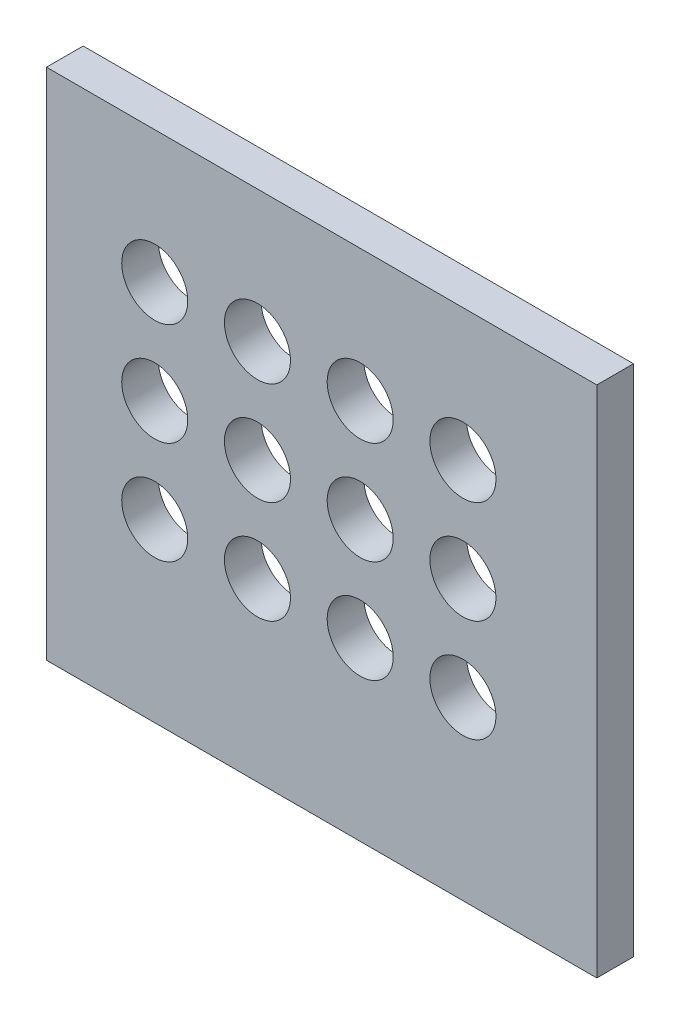
ISO-10303-21;
HEADER;
FILE_DESCRIPTION(('STEP AP214'),'2;1');
FILE_NAME('part.step','',(''),(''),'','','');
FILE_SCHEMA(('AUTOMOTIVE_DESIGN { 1 0 10303 214 1 1 1 1 }'));
ENDSEC;
DATA;
#1=APPLICATION_CONTEXT('core data for automotive mechanical design processes');
#2=APPLICATION_PROTOCOL_DEFINITION('international standard','automotive_design',2000,#1);
#3=PRODUCT_CONTEXT('',#1,'mechanical');
#4=PRODUCT('Part','Part','',(#3));
#5=PRODUCT_RELATED_PRODUCT_CATEGORY('part','',(#4));
#6=PRODUCT_DEFINITION_FORMATION('','',#4);
#7=PRODUCT_DEFINITION_CONTEXT('part definition',#1,'design');
#8=PRODUCT_DEFINITION('design','',#6,#7);
#9=PRODUCT_DEFINITION_SHAPE('','',#8);
#10=(LENGTH_UNIT() NAMED_UNIT(*) SI_UNIT(.MILLI.,.METRE.));
#11=(NAMED_UNIT(*) PLANE_ANGLE_UNIT() SI_UNIT($,.RADIAN.));
#12=(NAMED_UNIT(*) SI_UNIT($,.STERADIAN.) SOLID_ANGLE_UNIT());
#13=UNCERTAINTY_MEASURE_WITH_UNIT(LENGTH_MEASURE(1.E-05),#10,'distance_accuracy_value','');
#14=(GEOMETRIC_REPRESENTATION_CONTEXT(3) GLOBAL_UNCERTAINTY_ASSIGNED_CONTEXT((#13)) GLOBAL_UNIT_ASSIGNED_CONTEXT((#10,
#11,#12)) REPRESENTATION_CONTEXT('',''));
#15=CARTESIAN_POINT('',(0.,0.,0.));
#16=DIRECTION('',(0.,0.,1.));
#17=DIRECTION('',(1.,0.,0.));
#18=AXIS2_PLACEMENT_3D('',#15,#16,#17);
#19=CARTESIAN_POINT('',(75.,70.,0.));
#20=DIRECTION('',(0.,1.,0.));
#21=DIRECTION('',(0.,0.,1.));
#22=AXIS2_PLACEMENT_3D('',#19,#20,#21);
#23=PLANE('',#22);
#24=DIRECTION('',(-1.,0.,0.));
#25=VECTOR('',#24,1.);
#26=CARTESIAN_POINT('',(75.,70.,10.));
#27=LINE('',#26,#25);
#28=CARTESIAN_POINT('',(75.,70.,10.));
#29=VERTEX_POINT('',#28);
#30=CARTESIAN_POINT('',(-75.,70.,10.));
#31=VERTEX_POINT('',#30);
#32=EDGE_CURVE('E104',#29,#31,#27,.T.);
#33=ORIENTED_EDGE('',*,*,#32,.F.);
#34=DIRECTION('',(0.,0.,1.));
#35=VECTOR('',#34,1.);
#36=CARTESIAN_POINT('',(75.,70.,0.));
#37=LINE('',#36,#35);
#38=CARTESIAN_POINT('',(75.,70.,0.));
#39=VERTEX_POINT('',#38);
#40=EDGE_CURVE('E11',#39,#29,#37,.T.);
#41=ORIENTED_EDGE('',*,*,#40,.F.);
#42=DIRECTION('',(-1.,0.,0.));
#43=VECTOR('',#42,1.);
#44=CARTESIAN_POINT('',(75.,70.,0.));
#45=LINE('',#44,#43);
#46=CARTESIAN_POINT('',(-75.,70.,0.));
#47=VERTEX_POINT('',#46);
#48=EDGE_CURVE('E97',#39,#47,#45,.T.);
#49=ORIENTED_EDGE('',*,*,#48,.T.);
#50=DIRECTION('',(0.,0.,1.));
#51=VECTOR('',#50,1.);
#52=CARTESIAN_POINT('',(-75.,70.,0.));
#53=LINE('',#52,#51);
#54=EDGE_CURVE('E42',#47,#31,#53,.T.);
#55=ORIENTED_EDGE('',*,*,#54,.T.);
#56=EDGE_LOOP('',(#33,#41,#49,#55));
#57=FACE_BOUND('',#56,.T.);
#58=ADVANCED_FACE('F39',(#57),#23,.T.);
#59=CARTESIAN_POINT('',(75.,-70.,0.));
#60=DIRECTION('',(1.,0.,0.));
#61=DIRECTION('',(0.,0.,-1.));
#62=AXIS2_PLACEMENT_3D('',#59,#60,#61);
#63=PLANE('',#62);
#64=DIRECTION('',(0.,1.,0.));
#65=VECTOR('',#64,1.);
#66=CARTESIAN_POINT('',(75.,-70.,10.));
#67=LINE('',#66,#65);
#68=CARTESIAN_POINT('',(75.,-70.,10.));
#69=VERTEX_POINT('',#68);
#70=EDGE_CURVE('E99',#69,#29,#67,.T.);
#71=ORIENTED_EDGE('',*,*,#70,.F.);
#72=DIRECTION('',(0.,0.,1.));
#73=VECTOR('',#72,1.);
#74=CARTESIAN_POINT('',(75.,-70.,0.));
#75=LINE('',#74,#73);
#76=CARTESIAN_POINT('',(75.,-70.,0.));
#77=VERTEX_POINT('',#76);
#78=EDGE_CURVE('E48',#77,#69,#75,.T.);
#79=ORIENTED_EDGE('',*,*,#78,.F.);
#80=DIRECTION('',(0.,1.,0.));
#81=VECTOR('',#80,1.);
#82=CARTESIAN_POINT('',(75.,-70.,0.));
#83=LINE('',#82,#81);
#84=EDGE_CURVE('E94',#77,#39,#83,.T.);
#85=ORIENTED_EDGE('',*,*,#84,.T.);
#86=ORIENTED_EDGE('',*,*,#40,.T.);
#87=EDGE_LOOP('',(#71,#79,#85,#86));
#88=FACE_BOUND('',#87,.T.);
#89=ADVANCED_FACE('F115',(#88),#63,.T.);
#90=CARTESIAN_POINT('',(-75.,-70.,0.));
#91=DIRECTION('',(0.,-1.,0.));
#92=DIRECTION('',(0.,0.,-1.));
#93=AXIS2_PLACEMENT_3D('',#90,#91,#92);
#94=PLANE('',#93);
#95=DIRECTION('',(1.,0.,0.));
#96=VECTOR('',#95,1.);
#97=CARTESIAN_POINT('',(-75.,-70.,10.));
#98=LINE('',#97,#96);
#99=CARTESIAN_POINT('',(-75.,-70.,10.));
#100=VERTEX_POINT('',#99);
#101=EDGE_CURVE('E89',#100,#69,#98,.T.);
#102=ORIENTED_EDGE('',*,*,#101,.F.);
#103=DIRECTION('',(0.,0.,1.));
#104=VECTOR('',#103,1.);
#105=CARTESIAN_POINT('',(-75.,-70.,0.));
#106=LINE('',#105,#104);
#107=CARTESIAN_POINT('',(-75.,-70.,0.));
#108=VERTEX_POINT('',#107);
#109=EDGE_CURVE('E84',#108,#100,#106,.T.);
#110=ORIENTED_EDGE('',*,*,#109,.F.);
#111=DIRECTION('',(1.,0.,0.));
#112=VECTOR('',#111,1.);
#113=CARTESIAN_POINT('',(-75.,-70.,0.));
#114=LINE('',#113,#112);
#115=EDGE_CURVE('E87',#108,#77,#114,.T.);
#116=ORIENTED_EDGE('',*,*,#115,.T.);
#117=ORIENTED_EDGE('',*,*,#78,.T.);
#118=EDGE_LOOP('',(#102,#110,#116,#117));
#119=FACE_BOUND('',#118,.T.);
#120=ADVANCED_FACE('F86',(#119),#94,.T.);
#121=CARTESIAN_POINT('',(-75.,70.,0.));
#122=DIRECTION('',(-1.,0.,0.));
#123=DIRECTION('',(0.,0.,1.));
#124=AXIS2_PLACEMENT_3D('',#121,#122,#123);
#125=PLANE('',#124);
#126=DIRECTION('',(0.,-1.,0.));
#127=VECTOR('',#126,1.);
#128=CARTESIAN_POINT('',(-75.,70.,10.));
#129=LINE('',#128,#127);
#130=EDGE_CURVE('E107',#31,#100,#129,.T.);
#131=ORIENTED_EDGE('',*,*,#130,.F.);
#132=ORIENTED_EDGE('',*,*,#54,.F.);
#133=DIRECTION('',(0.,-1.,0.));
#134=VECTOR('',#133,1.);
#135=CARTESIAN_POINT('',(-75.,70.,0.));
#136=LINE('',#135,#134);
#137=EDGE_CURVE('E93',#47,#108,#136,.T.);
#138=ORIENTED_EDGE('',*,*,#137,.T.);
#139=ORIENTED_EDGE('',*,*,#109,.T.);
#140=EDGE_LOOP('',(#131,#132,#138,#139));
#141=FACE_BOUND('',#140,.T.);
#142=ADVANCED_FACE('F96',(#141),#125,.T.);
#143=CARTESIAN_POINT('',(0.,0.,0.));
#144=DIRECTION('',(0.,0.,1.));
#145=DIRECTION('',(1.,0.,0.));
#146=AXIS2_PLACEMENT_3D('',#143,#144,#145);
#147=PLANE('',#146);
#148=CARTESIAN_POINT('',(38.5,34.,0.));
#149=DIRECTION('',(0.,0.,1.));
#150=DIRECTION('',(-1.,0.,0.));
#151=AXIS2_PLACEMENT_3D('',#148,#149,#150);
#152=CIRCLE('',#151,9.);
#153=CARTESIAN_POINT('',(29.5,34.,0.));
#154=VERTEX_POINT('',#153);
#155=EDGE_CURVE('E188',#154,#154,#152,.T.);
#156=ORIENTED_EDGE('',*,*,#155,.T.);
#157=EDGE_LOOP('',(#156));
#158=FACE_BOUND('',#157,.T.);
#159=CARTESIAN_POINT('',(10.5,34.,0.));
#160=DIRECTION('',(0.,0.,1.));
#161=DIRECTION('',(-1.,0.,0.));
#162=AXIS2_PLACEMENT_3D('',#159,#160,#161);
#163=CIRCLE('',#162,9.);
#164=CARTESIAN_POINT('',(1.5,34.,0.));
#165=VERTEX_POINT('',#164);
#166=EDGE_CURVE('E196',#165,#165,#163,.T.);
#167=ORIENTED_EDGE('',*,*,#166,.T.);
#168=EDGE_LOOP('',(#167));
#169=FACE_BOUND('',#168,.T.);
#170=CARTESIAN_POINT('',(-17.5,34.,0.));
#171=DIRECTION('',(0.,0.,1.));
#172=DIRECTION('',(-1.,0.,0.));
#173=AXIS2_PLACEMENT_3D('',#170,#171,#172);
#174=CIRCLE('',#173,9.);
#175=CARTESIAN_POINT('',(-26.5,34.,0.));
#176=VERTEX_POINT('',#175);
#177=EDGE_CURVE('E202',#176,#176,#174,.T.);
#178=ORIENTED_EDGE('',*,*,#177,.T.);
#179=EDGE_LOOP('',(#178));
#180=FACE_BOUND('',#179,.T.);
#181=CARTESIAN_POINT('',(-45.5,34.,0.));
#182=DIRECTION('',(0.,0.,1.));
#183=DIRECTION('',(-1.,0.,0.));
#184=AXIS2_PLACEMENT_3D('',#181,#182,#183);
#185=CIRCLE('',#184,9.);
#186=CARTESIAN_POINT('',(-54.5,34.,0.));
#187=VERTEX_POINT('',#186);
#188=EDGE_CURVE('E208',#187,#187,#185,.T.);
#189=ORIENTED_EDGE('',*,*,#188,.T.);
#190=EDGE_LOOP('',(#189));
#191=FACE_BOUND('',#190,.T.);
#192=CARTESIAN_POINT('',(38.5,6.,0.));
#193=DIRECTION('',(0.,0.,1.));
#194=DIRECTION('',(-1.,0.,0.));
#195=AXIS2_PLACEMENT_3D('',#192,#193,#194);
#196=CIRCLE('',#195,9.);
#197=CARTESIAN_POINT('',(29.5,6.,0.));
#198=VERTEX_POINT('',#197);
#199=EDGE_CURVE('E214',#198,#198,#196,.T.);
#200=ORIENTED_EDGE('',*,*,#199,.T.);
#201=EDGE_LOOP('',(#200));
#202=FACE_BOUND('',#201,.T.);
#203=CARTESIAN_POINT('',(10.5,6.,0.));
#204=DIRECTION('',(0.,0.,1.));
#205=DIRECTION('',(-1.,0.,0.));
#206=AXIS2_PLACEMENT_3D('',#203,#204,#205);
#207=CIRCLE('',#206,9.);
#208=CARTESIAN_POINT('',(1.5,6.,0.));
#209=VERTEX_POINT('',#208);
#210=EDGE_CURVE('E220',#209,#209,#207,.T.);
#211=ORIENTED_EDGE('',*,*,#210,.T.);
#212=EDGE_LOOP('',(#211));
#213=FACE_BOUND('',#212,.T.);
#214=CARTESIAN_POINT('',(-17.5,6.,0.));
#215=DIRECTION('',(0.,0.,1.));
#216=DIRECTION('',(-1.,0.,0.));
#217=AXIS2_PLACEMENT_3D('',#214,#215,#216);
#218=CIRCLE('',#217,9.);
#219=CARTESIAN_POINT('',(-26.5,6.,0.));
#220=VERTEX_POINT('',#219);
#221=EDGE_CURVE('E226',#220,#220,#218,.T.);
#222=ORIENTED_EDGE('',*,*,#221,.T.);
#223=EDGE_LOOP('',(#222));
#224=FACE_BOUND('',#223,.T.);
#225=CARTESIAN_POINT('',(-45.5,6.,0.));
#226=DIRECTION('',(0.,0.,1.));
#227=DIRECTION('',(-1.,0.,0.));
#228=AXIS2_PLACEMENT_3D('',#225,#226,#227);
#229=CIRCLE('',#228,9.);
#230=CARTESIAN_POINT('',(-54.5,6.,0.));
#231=VERTEX_POINT('',#230);
#232=EDGE_CURVE('E232',#231,#231,#229,.T.);
#233=ORIENTED_EDGE('',*,*,#232,.T.);
#234=EDGE_LOOP('',(#233));
#235=FACE_BOUND('',#234,.T.);
#236=CARTESIAN_POINT('',(38.5,-22.,0.));
#237=DIRECTION('',(0.,0.,1.));
#238=DIRECTION('',(-1.,0.,0.));
#239=AXIS2_PLACEMENT_3D('',#236,#237,#238);
#240=CIRCLE('',#239,9.);
#241=CARTESIAN_POINT('',(29.5,-22.,0.));
#242=VERTEX_POINT('',#241);
#243=EDGE_CURVE('E238',#242,#242,#240,.T.);
#244=ORIENTED_EDGE('',*,*,#243,.T.);
#245=EDGE_LOOP('',(#244));
#246=FACE_BOUND('',#245,.T.);
#247=CARTESIAN_POINT('',(10.5,-22.,0.));
#248=DIRECTION('',(0.,0.,1.));
#249=DIRECTION('',(-1.,0.,0.));
#250=AXIS2_PLACEMENT_3D('',#247,#248,#249);
#251=CIRCLE('',#250,9.);
#252=CARTESIAN_POINT('',(1.5,-22.,0.));
#253=VERTEX_POINT('',#252);
#254=EDGE_CURVE('E244',#253,#253,#251,.T.);
#255=ORIENTED_EDGE('',*,*,#254,.T.);
#256=EDGE_LOOP('',(#255));
#257=FACE_BOUND('',#256,.T.);
#258=CARTESIAN_POINT('',(-45.5,-22.,0.));
#259=DIRECTION('',(0.,0.,1.));
#260=DIRECTION('',(-1.,0.,0.));
#261=AXIS2_PLACEMENT_3D('',#258,#259,#260);
#262=CIRCLE('',#261,9.);
#263=CARTESIAN_POINT('',(-54.5,-22.,0.));
#264=VERTEX_POINT('',#263);
#265=EDGE_CURVE('E250',#264,#264,#262,.T.);
#266=ORIENTED_EDGE('',*,*,#265,.T.);
#267=EDGE_LOOP('',(#266));
#268=FACE_BOUND('',#267,.T.);
#269=CARTESIAN_POINT('',(-17.5,-22.,0.));
#270=DIRECTION('',(0.,0.,1.));
#271=DIRECTION('',(-1.,0.,0.));
#272=AXIS2_PLACEMENT_3D('',#269,#270,#271);
#273=CIRCLE('',#272,9.);
#274=CARTESIAN_POINT('',(-26.5,-22.,0.));
#275=VERTEX_POINT('',#274);
#276=EDGE_CURVE('E108',#275,#275,#273,.T.);
#277=ORIENTED_EDGE('',*,*,#276,.T.);
#278=EDGE_LOOP('',(#277));
#279=FACE_BOUND('',#278,.T.);
#280=ORIENTED_EDGE('',*,*,#48,.F.);
#281=ORIENTED_EDGE('',*,*,#84,.F.);
#282=ORIENTED_EDGE('',*,*,#115,.F.);
#283=ORIENTED_EDGE('',*,*,#137,.F.);
#284=EDGE_LOOP('',(#280,#281,#282,#283));
#285=FACE_BOUND('',#284,.T.);
#286=ADVANCED_FACE('F92',(#158,#169,#180,#191,#202,#213,#224,#235,#246,#257,#268,#279,#285),
#147,.F.);
#287=CARTESIAN_POINT('',(0.,0.,10.));
#288=DIRECTION('',(0.,0.,1.));
#289=DIRECTION('',(1.,0.,0.));
#290=AXIS2_PLACEMENT_3D('',#287,#288,#289);
#291=PLANE('',#290);
#292=CARTESIAN_POINT('',(38.5,34.,10.));
#293=DIRECTION('',(0.,0.,1.));
#294=DIRECTION('',(-1.,0.,0.));
#295=AXIS2_PLACEMENT_3D('',#292,#293,#294);
#296=CIRCLE('',#295,9.);
#297=CARTESIAN_POINT('',(29.5,34.,10.));
#298=VERTEX_POINT('',#297);
#299=EDGE_CURVE('E191',#298,#298,#296,.T.);
#300=ORIENTED_EDGE('',*,*,#299,.F.);
#301=EDGE_LOOP('',(#300));
#302=FACE_BOUND('',#301,.T.);
#303=CARTESIAN_POINT('',(10.5,34.,10.));
#304=DIRECTION('',(0.,0.,1.));
#305=DIRECTION('',(-1.,0.,0.));
#306=AXIS2_PLACEMENT_3D('',#303,#304,#305);
#307=CIRCLE('',#306,9.);
#308=CARTESIAN_POINT('',(1.5,34.,10.));
#309=VERTEX_POINT('',#308);
#310=EDGE_CURVE('E193',#309,#309,#307,.T.);
#311=ORIENTED_EDGE('',*,*,#310,.F.);
#312=EDGE_LOOP('',(#311));
#313=FACE_BOUND('',#312,.T.);
#314=CARTESIAN_POINT('',(-17.5,34.,10.));
#315=DIRECTION('',(0.,0.,1.));
#316=DIRECTION('',(-1.,0.,0.));
#317=AXIS2_PLACEMENT_3D('',#314,#315,#316);
#318=CIRCLE('',#317,9.);
#319=CARTESIAN_POINT('',(-26.5,34.,10.));
#320=VERTEX_POINT('',#319);
#321=EDGE_CURVE('E199',#320,#320,#318,.T.);
#322=ORIENTED_EDGE('',*,*,#321,.F.);
#323=EDGE_LOOP('',(#322));
#324=FACE_BOUND('',#323,.T.);
#325=CARTESIAN_POINT('',(-45.5,34.,10.));
#326=DIRECTION('',(0.,0.,1.));
#327=DIRECTION('',(-1.,0.,0.));
#328=AXIS2_PLACEMENT_3D('',#325,#326,#327);
#329=CIRCLE('',#328,9.);
#330=CARTESIAN_POINT('',(-54.5,34.,10.));
#331=VERTEX_POINT('',#330);
#332=EDGE_CURVE('E205',#331,#331,#329,.T.);
#333=ORIENTED_EDGE('',*,*,#332,.F.);
#334=EDGE_LOOP('',(#333));
#335=FACE_BOUND('',#334,.T.);
#336=CARTESIAN_POINT('',(38.5,6.,10.));
#337=DIRECTION('',(0.,0.,1.));
#338=DIRECTION('',(-1.,0.,0.));
#339=AXIS2_PLACEMENT_3D('',#336,#337,#338);
#340=CIRCLE('',#339,9.);
#341=CARTESIAN_POINT('',(29.5,6.,10.));
#342=VERTEX_POINT('',#341);
#343=EDGE_CURVE('E211',#342,#342,#340,.T.);
#344=ORIENTED_EDGE('',*,*,#343,.F.);
#345=EDGE_LOOP('',(#344));
#346=FACE_BOUND('',#345,.T.);
#347=CARTESIAN_POINT('',(10.5,6.,10.));
#348=DIRECTION('',(0.,0.,1.));
#349=DIRECTION('',(-1.,0.,0.));
#350=AXIS2_PLACEMENT_3D('',#347,#348,#349);
#351=CIRCLE('',#350,9.);
#352=CARTESIAN_POINT('',(1.5,6.,10.));
#353=VERTEX_POINT('',#352);
#354=EDGE_CURVE('E217',#353,#353,#351,.T.);
#355=ORIENTED_EDGE('',*,*,#354,.F.);
#356=EDGE_LOOP('',(#355));
#357=FACE_BOUND('',#356,.T.);
#358=CARTESIAN_POINT('',(-17.5,6.,10.));
#359=DIRECTION('',(0.,0.,1.));
#360=DIRECTION('',(-1.,0.,0.));
#361=AXIS2_PLACEMENT_3D('',#358,#359,#360);
#362=CIRCLE('',#361,9.);
#363=CARTESIAN_POINT('',(-26.5,6.,10.));
#364=VERTEX_POINT('',#363);
#365=EDGE_CURVE('E223',#364,#364,#362,.T.);
#366=ORIENTED_EDGE('',*,*,#365,.F.);
#367=EDGE_LOOP('',(#366));
#368=FACE_BOUND('',#367,.T.);
#369=CARTESIAN_POINT('',(-45.5,6.,10.));
#370=DIRECTION('',(0.,0.,1.));
#371=DIRECTION('',(-1.,0.,0.));
#372=AXIS2_PLACEMENT_3D('',#369,#370,#371);
#373=CIRCLE('',#372,9.);
#374=CARTESIAN_POINT('',(-54.5,6.,10.));
#375=VERTEX_POINT('',#374);
#376=EDGE_CURVE('E229',#375,#375,#373,.T.);
#377=ORIENTED_EDGE('',*,*,#376,.F.);
#378=EDGE_LOOP('',(#377));
#379=FACE_BOUND('',#378,.T.);
#380=CARTESIAN_POINT('',(38.5,-22.,10.));
#381=DIRECTION('',(0.,0.,1.));
#382=DIRECTION('',(-1.,0.,0.));
#383=AXIS2_PLACEMENT_3D('',#380,#381,#382);
#384=CIRCLE('',#383,9.);
#385=CARTESIAN_POINT('',(29.5,-22.,10.));
#386=VERTEX_POINT('',#385);
#387=EDGE_CURVE('E235',#386,#386,#384,.T.);
#388=ORIENTED_EDGE('',*,*,#387,.F.);
#389=EDGE_LOOP('',(#388));
#390=FACE_BOUND('',#389,.T.);
#391=CARTESIAN_POINT('',(10.5,-22.,10.));
#392=DIRECTION('',(0.,0.,1.));
#393=DIRECTION('',(-1.,0.,0.));
#394=AXIS2_PLACEMENT_3D('',#391,#392,#393);
#395=CIRCLE('',#394,9.);
#396=CARTESIAN_POINT('',(1.5,-22.,10.));
#397=VERTEX_POINT('',#396);
#398=EDGE_CURVE('E241',#397,#397,#395,.T.);
#399=ORIENTED_EDGE('',*,*,#398,.F.);
#400=EDGE_LOOP('',(#399));
#401=FACE_BOUND('',#400,.T.);
#402=CARTESIAN_POINT('',(-45.5,-22.,10.));
#403=DIRECTION('',(0.,0.,1.));
#404=DIRECTION('',(-1.,0.,0.));
#405=AXIS2_PLACEMENT_3D('',#402,#403,#404);
#406=CIRCLE('',#405,9.);
#407=CARTESIAN_POINT('',(-54.5,-22.,10.));
#408=VERTEX_POINT('',#407);
#409=EDGE_CURVE('E247',#408,#408,#406,.T.);
#410=ORIENTED_EDGE('',*,*,#409,.F.);
#411=EDGE_LOOP('',(#410));
#412=FACE_BOUND('',#411,.T.);
#413=CARTESIAN_POINT('',(-17.5,-22.,10.));
#414=DIRECTION('',(0.,0.,1.));
#415=DIRECTION('',(-1.,0.,0.));
#416=AXIS2_PLACEMENT_3D('',#413,#414,#415);
#417=CIRCLE('',#416,9.);
#418=CARTESIAN_POINT('',(-26.5,-22.,10.));
#419=VERTEX_POINT('',#418);
#420=EDGE_CURVE('E253',#419,#419,#417,.T.);
#421=ORIENTED_EDGE('',*,*,#420,.F.);
#422=EDGE_LOOP('',(#421));
#423=FACE_BOUND('',#422,.T.);
#424=ORIENTED_EDGE('',*,*,#32,.T.);
#425=ORIENTED_EDGE('',*,*,#130,.T.);
#426=ORIENTED_EDGE('',*,*,#101,.T.);
#427=ORIENTED_EDGE('',*,*,#70,.T.);
#428=EDGE_LOOP('',(#424,#425,#426,#427));
#429=FACE_BOUND('',#428,.T.);
#430=ADVANCED_FACE('F114',(#302,#313,#324,#335,#346,#357,#368,#379,#390,#401,#412,#423,#429),
#291,.T.);
#431=CARTESIAN_POINT('',(-17.5,-22.,0.));
#432=DIRECTION('',(0.,0.,1.));
#433=DIRECTION('',(1.,0.,0.));
#434=AXIS2_PLACEMENT_3D('',#431,#432,#433);
#435=CYLINDRICAL_SURFACE('',#434,9.);
#436=ORIENTED_EDGE('',*,*,#276,.F.);
#437=EDGE_LOOP('',(#436));
#438=FACE_BOUND('',#437,.T.);
#439=ORIENTED_EDGE('',*,*,#420,.T.);
#440=EDGE_LOOP('',(#439));
#441=FACE_BOUND('',#440,.T.);
#442=ADVANCED_FACE('F133',(#438,#441),#435,.F.);
#443=CARTESIAN_POINT('',(-45.5,-22.,0.));
#444=DIRECTION('',(0.,0.,1.));
#445=DIRECTION('',(1.,0.,0.));
#446=AXIS2_PLACEMENT_3D('',#443,#444,#445);
#447=CYLINDRICAL_SURFACE('',#446,9.);
#448=ORIENTED_EDGE('',*,*,#265,.F.);
#449=EDGE_LOOP('',(#448));
#450=FACE_BOUND('',#449,.T.);
#451=ORIENTED_EDGE('',*,*,#409,.T.);
#452=EDGE_LOOP('',(#451));
#453=FACE_BOUND('',#452,.T.);
#454=ADVANCED_FACE('F140',(#450,#453),#447,.F.);
#455=CARTESIAN_POINT('',(10.5,-22.,0.));
#456=DIRECTION('',(0.,0.,1.));
#457=DIRECTION('',(1.,0.,0.));
#458=AXIS2_PLACEMENT_3D('',#455,#456,#457);
#459=CYLINDRICAL_SURFACE('',#458,9.);
#460=ORIENTED_EDGE('',*,*,#254,.F.);
#461=EDGE_LOOP('',(#460));
#462=FACE_BOUND('',#461,.T.);
#463=ORIENTED_EDGE('',*,*,#398,.T.);
#464=EDGE_LOOP('',(#463));
#465=FACE_BOUND('',#464,.T.);
#466=ADVANCED_FACE('F144',(#462,#465),#459,.F.);
#467=CARTESIAN_POINT('',(38.5,-22.,0.));
#468=DIRECTION('',(0.,0.,1.));
#469=DIRECTION('',(1.,0.,0.));
#470=AXIS2_PLACEMENT_3D('',#467,#468,#469);
#471=CYLINDRICAL_SURFACE('',#470,9.);
#472=ORIENTED_EDGE('',*,*,#243,.F.);
#473=EDGE_LOOP('',(#472));
#474=FACE_BOUND('',#473,.T.);
#475=ORIENTED_EDGE('',*,*,#387,.T.);
#476=EDGE_LOOP('',(#475));
#477=FACE_BOUND('',#476,.T.);
#478=ADVANCED_FACE('F148',(#474,#477),#471,.F.);
#479=CARTESIAN_POINT('',(-45.5,6.,0.));
#480=DIRECTION('',(0.,0.,1.));
#481=DIRECTION('',(1.,0.,0.));
#482=AXIS2_PLACEMENT_3D('',#479,#480,#481);
#483=CYLINDRICAL_SURFACE('',#482,9.);
#484=ORIENTED_EDGE('',*,*,#232,.F.);
#485=EDGE_LOOP('',(#484));
#486=FACE_BOUND('',#485,.T.);
#487=ORIENTED_EDGE('',*,*,#376,.T.);
#488=EDGE_LOOP('',(#487));
#489=FACE_BOUND('',#488,.T.);
#490=ADVANCED_FACE('F152',(#486,#489),#483,.F.);
#491=CARTESIAN_POINT('',(-17.5,6.,0.));
#492=DIRECTION('',(0.,0.,1.));
#493=DIRECTION('',(1.,0.,0.));
#494=AXIS2_PLACEMENT_3D('',#491,#492,#493);
#495=CYLINDRICAL_SURFACE('',#494,9.);
#496=ORIENTED_EDGE('',*,*,#221,.F.);
#497=EDGE_LOOP('',(#496));
#498=FACE_BOUND('',#497,.T.);
#499=ORIENTED_EDGE('',*,*,#365,.T.);
#500=EDGE_LOOP('',(#499));
#501=FACE_BOUND('',#500,.T.);
#502=ADVANCED_FACE('F156',(#498,#501),#495,.F.);
#503=CARTESIAN_POINT('',(10.5,6.,0.));
#504=DIRECTION('',(0.,0.,1.));
#505=DIRECTION('',(1.,0.,0.));
#506=AXIS2_PLACEMENT_3D('',#503,#504,#505);
#507=CYLINDRICAL_SURFACE('',#506,9.);
#508=ORIENTED_EDGE('',*,*,#210,.F.);
#509=EDGE_LOOP('',(#508));
#510=FACE_BOUND('',#509,.T.);
#511=ORIENTED_EDGE('',*,*,#354,.T.);
#512=EDGE_LOOP('',(#511));
#513=FACE_BOUND('',#512,.T.);
#514=ADVANCED_FACE('F160',(#510,#513),#507,.F.);
#515=CARTESIAN_POINT('',(38.5,6.,0.));
#516=DIRECTION('',(0.,0.,1.));
#517=DIRECTION('',(1.,0.,0.));
#518=AXIS2_PLACEMENT_3D('',#515,#516,#517);
#519=CYLINDRICAL_SURFACE('',#518,9.);
#520=ORIENTED_EDGE('',*,*,#199,.F.);
#521=EDGE_LOOP('',(#520));
#522=FACE_BOUND('',#521,.T.);
#523=ORIENTED_EDGE('',*,*,#343,.T.);
#524=EDGE_LOOP('',(#523));
#525=FACE_BOUND('',#524,.T.);
#526=ADVANCED_FACE('F164',(#522,#525),#519,.F.);
#527=CARTESIAN_POINT('',(-45.5,34.,0.));
#528=DIRECTION('',(0.,0.,1.));
#529=DIRECTION('',(1.,0.,0.));
#530=AXIS2_PLACEMENT_3D('',#527,#528,#529);
#531=CYLINDRICAL_SURFACE('',#530,9.);
#532=ORIENTED_EDGE('',*,*,#188,.F.);
#533=EDGE_LOOP('',(#532));
#534=FACE_BOUND('',#533,.T.);
#535=ORIENTED_EDGE('',*,*,#332,.T.);
#536=EDGE_LOOP('',(#535));
#537=FACE_BOUND('',#536,.T.);
#538=ADVANCED_FACE('F168',(#534,#537),#531,.F.);
#539=CARTESIAN_POINT('',(-17.5,34.,0.));
#540=DIRECTION('',(0.,0.,1.));
#541=DIRECTION('',(1.,0.,0.));
#542=AXIS2_PLACEMENT_3D('',#539,#540,#541);
#543=CYLINDRICAL_SURFACE('',#542,9.);
#544=ORIENTED_EDGE('',*,*,#177,.F.);
#545=EDGE_LOOP('',(#544));
#546=FACE_BOUND('',#545,.T.);
#547=ORIENTED_EDGE('',*,*,#321,.T.);
#548=EDGE_LOOP('',(#547));
#549=FACE_BOUND('',#548,.T.);
#550=ADVANCED_FACE('F172',(#546,#549),#543,.F.);
#551=CARTESIAN_POINT('',(10.5,34.,0.));
#552=DIRECTION('',(0.,0.,1.));
#553=DIRECTION('',(1.,0.,0.));
#554=AXIS2_PLACEMENT_3D('',#551,#552,#553);
#555=CYLINDRICAL_SURFACE('',#554,9.);
#556=ORIENTED_EDGE('',*,*,#166,.F.);
#557=EDGE_LOOP('',(#556));
#558=FACE_BOUND('',#557,.T.);
#559=ORIENTED_EDGE('',*,*,#310,.T.);
#560=EDGE_LOOP('',(#559));
#561=FACE_BOUND('',#560,.T.);
#562=ADVANCED_FACE('F176',(#558,#561),#555,.F.);
#563=CARTESIAN_POINT('',(38.5,34.,0.));
#564=DIRECTION('',(0.,0.,1.));
#565=DIRECTION('',(1.,0.,0.));
#566=AXIS2_PLACEMENT_3D('',#563,#564,#565);
#567=CYLINDRICAL_SURFACE('',#566,9.);
#568=ORIENTED_EDGE('',*,*,#155,.F.);
#569=EDGE_LOOP('',(#568));
#570=FACE_BOUND('',#569,.T.);
#571=ORIENTED_EDGE('',*,*,#299,.T.);
#572=EDGE_LOOP('',(#571));
#573=FACE_BOUND('',#572,.T.);
#574=ADVANCED_FACE('F180',(#570,#573),#567,.F.);
#575=CLOSED_SHELL('',(#58,#89,#120,#142,#286,#430,#442,#454,#466,#478,#490,#502,#514,#526,#538,
#550,#562,#574));
#576=MANIFOLD_SOLID_BREP('B2',#575);
#577=ADVANCED_BREP_SHAPE_REPRESENTATION('',(#18,#576),#14);
#578=SHAPE_DEFINITION_REPRESENTATION(#9,#577);
ENDSEC;
END-ISO-10303-21;
